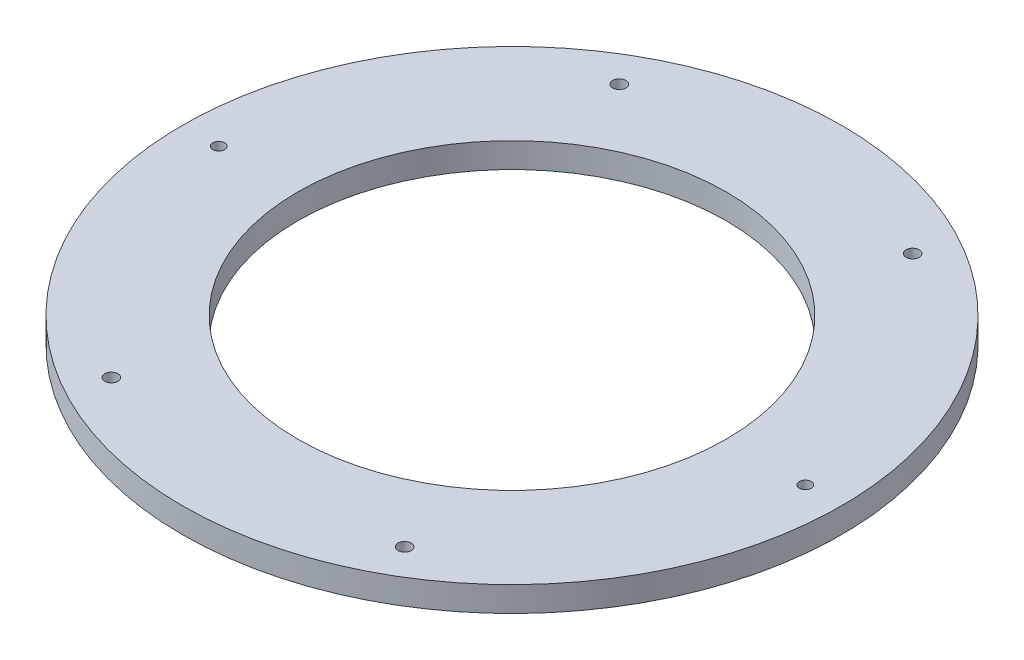
ISO-10303-21;
HEADER;
FILE_DESCRIPTION(('STEP AP214'),'2;1');
FILE_NAME('part.step','',(''),(''),'','','');
FILE_SCHEMA(('AUTOMOTIVE_DESIGN { 1 0 10303 214 1 1 1 1 }'));
ENDSEC;
DATA;
#1=APPLICATION_CONTEXT('core data for automotive mechanical design processes');
#2=APPLICATION_PROTOCOL_DEFINITION('international standard','automotive_design',2000,#1);
#3=PRODUCT_CONTEXT('',#1,'mechanical');
#4=PRODUCT('Part','Part','',(#3));
#5=PRODUCT_RELATED_PRODUCT_CATEGORY('part','',(#4));
#6=PRODUCT_DEFINITION_FORMATION('','',#4);
#7=PRODUCT_DEFINITION_CONTEXT('part definition',#1,'design');
#8=PRODUCT_DEFINITION('design','',#6,#7);
#9=PRODUCT_DEFINITION_SHAPE('','',#8);
#10=(LENGTH_UNIT() NAMED_UNIT(*) SI_UNIT(.MILLI.,.METRE.));
#11=(NAMED_UNIT(*) PLANE_ANGLE_UNIT() SI_UNIT($,.RADIAN.));
#12=(NAMED_UNIT(*) SI_UNIT($,.STERADIAN.) SOLID_ANGLE_UNIT());
#13=UNCERTAINTY_MEASURE_WITH_UNIT(LENGTH_MEASURE(1.E-05),#10,'distance_accuracy_value','');
#14=(GEOMETRIC_REPRESENTATION_CONTEXT(3) GLOBAL_UNCERTAINTY_ASSIGNED_CONTEXT((#13)) GLOBAL_UNIT_ASSIGNED_CONTEXT((#10,
#11,#12)) REPRESENTATION_CONTEXT('',''));
#15=CARTESIAN_POINT('',(0.,0.,0.));
#16=DIRECTION('',(0.,0.,1.));
#17=DIRECTION('',(1.,0.,0.));
#18=AXIS2_PLACEMENT_3D('',#15,#16,#17);
#19=CARTESIAN_POINT('',(0.,9.5,0.));
#20=DIRECTION('',(0.,1.,0.));
#21=DIRECTION('',(0.,0.,1.));
#22=AXIS2_PLACEMENT_3D('',#19,#20,#21);
#23=PLANE('',#22);
#24=CARTESIAN_POINT('',(111.25,9.5,-192.690652342037));
#25=DIRECTION('',(0.,1.,0.));
#26=DIRECTION('',(0.,0.,1.));
#27=AXIS2_PLACEMENT_3D('',#24,#25,#26);
#28=CIRCLE('',#27,4.99999999999979);
#29=CARTESIAN_POINT('',(111.25,9.5,-187.690652342038));
#30=VERTEX_POINT('',#29);
#31=EDGE_CURVE('E74',#30,#30,#28,.T.);
#32=ORIENTED_EDGE('',*,*,#31,.F.);
#33=EDGE_LOOP('',(#32));
#34=FACE_BOUND('',#33,.T.);
#35=CARTESIAN_POINT('',(222.5,9.5,0.));
#36=DIRECTION('',(0.,1.,0.));
#37=DIRECTION('',(0.,0.,1.));
#38=AXIS2_PLACEMENT_3D('',#35,#36,#37);
#39=CIRCLE('',#38,4.49999999999999);
#40=CARTESIAN_POINT('',(222.5,9.5,4.49999999999999));
#41=VERTEX_POINT('',#40);
#42=EDGE_CURVE('E68',#41,#41,#39,.T.);
#43=ORIENTED_EDGE('',*,*,#42,.F.);
#44=EDGE_LOOP('',(#43));
#45=FACE_BOUND('',#44,.T.);
#46=CARTESIAN_POINT('',(-111.249999999999,9.5,192.690652342038));
#47=DIRECTION('',(0.,1.,0.));
#48=DIRECTION('',(0.,0.,-1.));
#49=AXIS2_PLACEMENT_3D('',#46,#47,#48);
#50=CIRCLE('',#49,5.00000000000001);
#51=CARTESIAN_POINT('',(-111.249999999999,9.5,187.690652342038));
#52=VERTEX_POINT('',#51);
#53=EDGE_CURVE('E62',#52,#52,#50,.T.);
#54=ORIENTED_EDGE('',*,*,#53,.F.);
#55=EDGE_LOOP('',(#54));
#56=FACE_BOUND('',#55,.T.);
#57=CARTESIAN_POINT('',(-222.5,9.5,1.55431223447522E-12));
#58=DIRECTION('',(0.,1.,0.));
#59=DIRECTION('',(0.,0.,-1.));
#60=AXIS2_PLACEMENT_3D('',#57,#58,#59);
#61=CIRCLE('',#60,4.49999999999999);
#62=CARTESIAN_POINT('',(-222.5,9.5,-4.49999999999844));
#63=VERTEX_POINT('',#62);
#64=EDGE_CURVE('E55',#63,#63,#61,.T.);
#65=ORIENTED_EDGE('',*,*,#64,.F.);
#66=EDGE_LOOP('',(#65));
#67=FACE_BOUND('',#66,.T.);
#68=CARTESIAN_POINT('',(111.25,9.5,192.690652342038));
#69=DIRECTION('',(0.,1.,0.));
#70=DIRECTION('',(0.,0.,-1.));
#71=AXIS2_PLACEMENT_3D('',#68,#69,#70);
#72=CIRCLE('',#71,5.00000000000001);
#73=CARTESIAN_POINT('',(111.25,9.5,187.690652342038));
#74=VERTEX_POINT('',#73);
#75=EDGE_CURVE('E79',#74,#74,#72,.T.);
#76=ORIENTED_EDGE('',*,*,#75,.F.);
#77=EDGE_LOOP('',(#76));
#78=FACE_BOUND('',#77,.T.);
#79=CARTESIAN_POINT('',(-111.249999999999,9.5,-192.690652342038));
#80=DIRECTION('',(0.,1.,0.));
#81=DIRECTION('',(0.,0.,1.));
#82=AXIS2_PLACEMENT_3D('',#79,#80,#81);
#83=CIRCLE('',#82,4.99999999999977);
#84=CARTESIAN_POINT('',(-111.249999999999,9.5,-187.690652342039));
#85=VERTEX_POINT('',#84);
#86=EDGE_CURVE('E49',#85,#85,#83,.T.);
#87=ORIENTED_EDGE('',*,*,#86,.F.);
#88=EDGE_LOOP('',(#87));
#89=FACE_BOUND('',#88,.T.);
#90=CARTESIAN_POINT('',(0.,9.5,0.));
#91=DIRECTION('',(0.,1.,0.));
#92=DIRECTION('',(0.,0.,1.));
#93=AXIS2_PLACEMENT_3D('',#90,#91,#92);
#94=CIRCLE('',#93,250.);
#95=CARTESIAN_POINT('',(0.,9.5,250.));
#96=VERTEX_POINT('',#95);
#97=EDGE_CURVE('E10',#96,#96,#94,.T.);
#98=ORIENTED_EDGE('',*,*,#97,.T.);
#99=EDGE_LOOP('',(#98));
#100=FACE_BOUND('',#99,.T.);
#101=CARTESIAN_POINT('',(0.,9.5,0.));
#102=DIRECTION('',(0.,1.,0.));
#103=DIRECTION('',(0.,0.,1.));
#104=AXIS2_PLACEMENT_3D('',#101,#102,#103);
#105=CIRCLE('',#104,162.5);
#106=CARTESIAN_POINT('',(0.,9.5,162.5));
#107=VERTEX_POINT('',#106);
#108=EDGE_CURVE('E41',#107,#107,#105,.T.);
#109=ORIENTED_EDGE('',*,*,#108,.F.);
#110=EDGE_LOOP('',(#109));
#111=FACE_BOUND('',#110,.T.);
#112=ADVANCED_FACE('F30',(#34,#45,#56,#67,#78,#89,#100,#111),#23,.T.);
#113=CARTESIAN_POINT('',(0.,-9.5,0.));
#114=DIRECTION('',(0.,1.,0.));
#115=DIRECTION('',(0.,0.,1.));
#116=AXIS2_PLACEMENT_3D('',#113,#114,#115);
#117=PLANE('',#116);
#118=CARTESIAN_POINT('',(111.25,-9.5,-192.690652342037));
#119=DIRECTION('',(0.,1.,0.));
#120=DIRECTION('',(0.,0.,1.));
#121=AXIS2_PLACEMENT_3D('',#118,#119,#120);
#122=CIRCLE('',#121,4.99999999999979);
#123=CARTESIAN_POINT('',(111.25,-9.5,-187.690652342038));
#124=VERTEX_POINT('',#123);
#125=EDGE_CURVE('E52',#124,#124,#122,.T.);
#126=ORIENTED_EDGE('',*,*,#125,.T.);
#127=EDGE_LOOP('',(#126));
#128=FACE_BOUND('',#127,.T.);
#129=CARTESIAN_POINT('',(222.5,-9.5,0.));
#130=DIRECTION('',(0.,1.,0.));
#131=DIRECTION('',(0.,0.,1.));
#132=AXIS2_PLACEMENT_3D('',#129,#130,#131);
#133=CIRCLE('',#132,4.49999999999999);
#134=CARTESIAN_POINT('',(222.5,-9.5,4.49999999999999));
#135=VERTEX_POINT('',#134);
#136=EDGE_CURVE('E71',#135,#135,#133,.T.);
#137=ORIENTED_EDGE('',*,*,#136,.T.);
#138=EDGE_LOOP('',(#137));
#139=FACE_BOUND('',#138,.T.);
#140=CARTESIAN_POINT('',(-111.249999999999,-9.5,192.690652342038));
#141=DIRECTION('',(0.,1.,0.));
#142=DIRECTION('',(0.,0.,-1.));
#143=AXIS2_PLACEMENT_3D('',#140,#141,#142);
#144=CIRCLE('',#143,5.00000000000001);
#145=CARTESIAN_POINT('',(-111.249999999999,-9.5,187.690652342038));
#146=VERTEX_POINT('',#145);
#147=EDGE_CURVE('E65',#146,#146,#144,.T.);
#148=ORIENTED_EDGE('',*,*,#147,.T.);
#149=EDGE_LOOP('',(#148));
#150=FACE_BOUND('',#149,.T.);
#151=CARTESIAN_POINT('',(-222.5,-9.5,1.55431223447522E-12));
#152=DIRECTION('',(0.,1.,0.));
#153=DIRECTION('',(0.,0.,-1.));
#154=AXIS2_PLACEMENT_3D('',#151,#152,#153);
#155=CIRCLE('',#154,4.49999999999999);
#156=CARTESIAN_POINT('',(-222.5,-9.5,-4.49999999999844));
#157=VERTEX_POINT('',#156);
#158=EDGE_CURVE('E58',#157,#157,#155,.T.);
#159=ORIENTED_EDGE('',*,*,#158,.T.);
#160=EDGE_LOOP('',(#159));
#161=FACE_BOUND('',#160,.T.);
#162=CARTESIAN_POINT('',(111.25,-9.5,192.690652342038));
#163=DIRECTION('',(0.,1.,0.));
#164=DIRECTION('',(0.,0.,-1.));
#165=AXIS2_PLACEMENT_3D('',#162,#163,#164);
#166=CIRCLE('',#165,5.00000000000001);
#167=CARTESIAN_POINT('',(111.25,-9.5,187.690652342038));
#168=VERTEX_POINT('',#167);
#169=EDGE_CURVE('E59',#168,#168,#166,.T.);
#170=ORIENTED_EDGE('',*,*,#169,.T.);
#171=EDGE_LOOP('',(#170));
#172=FACE_BOUND('',#171,.T.);
#173=CARTESIAN_POINT('',(-111.249999999999,-9.5,-192.690652342038));
#174=DIRECTION('',(0.,1.,0.));
#175=DIRECTION('',(0.,0.,1.));
#176=AXIS2_PLACEMENT_3D('',#173,#174,#175);
#177=CIRCLE('',#176,4.99999999999977);
#178=CARTESIAN_POINT('',(-111.249999999999,-9.5,-187.690652342039));
#179=VERTEX_POINT('',#178);
#180=EDGE_CURVE('E46',#179,#179,#177,.T.);
#181=ORIENTED_EDGE('',*,*,#180,.T.);
#182=EDGE_LOOP('',(#181));
#183=FACE_BOUND('',#182,.T.);
#184=CARTESIAN_POINT('',(0.,-9.5,0.));
#185=DIRECTION('',(0.,1.,0.));
#186=DIRECTION('',(0.,0.,1.));
#187=AXIS2_PLACEMENT_3D('',#184,#185,#186);
#188=CIRCLE('',#187,250.);
#189=CARTESIAN_POINT('',(0.,-9.5,250.));
#190=VERTEX_POINT('',#189);
#191=EDGE_CURVE('E34',#190,#190,#188,.T.);
#192=ORIENTED_EDGE('',*,*,#191,.F.);
#193=EDGE_LOOP('',(#192));
#194=FACE_BOUND('',#193,.T.);
#195=CARTESIAN_POINT('',(0.,-9.5,0.));
#196=DIRECTION('',(0.,1.,0.));
#197=DIRECTION('',(0.,0.,1.));
#198=AXIS2_PLACEMENT_3D('',#195,#196,#197);
#199=CIRCLE('',#198,162.5);
#200=CARTESIAN_POINT('',(0.,-9.5,162.5));
#201=VERTEX_POINT('',#200);
#202=EDGE_CURVE('E43',#201,#201,#199,.T.);
#203=ORIENTED_EDGE('',*,*,#202,.T.);
#204=EDGE_LOOP('',(#203));
#205=FACE_BOUND('',#204,.T.);
#206=ADVANCED_FACE('F85',(#128,#139,#150,#161,#172,#183,#194,#205),#117,.F.);
#207=CARTESIAN_POINT('',(0.,9.5,0.));
#208=DIRECTION('',(0.,-1.,0.));
#209=DIRECTION('',(0.,0.,-1.));
#210=AXIS2_PLACEMENT_3D('',#207,#208,#209);
#211=CYLINDRICAL_SURFACE('',#210,250.);
#212=ORIENTED_EDGE('',*,*,#97,.F.);
#213=EDGE_LOOP('',(#212));
#214=FACE_BOUND('',#213,.T.);
#215=ORIENTED_EDGE('',*,*,#191,.T.);
#216=EDGE_LOOP('',(#215));
#217=FACE_BOUND('',#216,.T.);
#218=ADVANCED_FACE('F32',(#214,#217),#211,.T.);
#219=CARTESIAN_POINT('',(0.,9.5,0.));
#220=DIRECTION('',(0.,-1.,0.));
#221=DIRECTION('',(0.,0.,-1.));
#222=AXIS2_PLACEMENT_3D('',#219,#220,#221);
#223=CYLINDRICAL_SURFACE('',#222,162.5);
#224=ORIENTED_EDGE('',*,*,#108,.T.);
#225=EDGE_LOOP('',(#224));
#226=FACE_BOUND('',#225,.T.);
#227=ORIENTED_EDGE('',*,*,#202,.F.);
#228=EDGE_LOOP('',(#227));
#229=FACE_BOUND('',#228,.T.);
#230=ADVANCED_FACE('F104',(#226,#229),#223,.F.);
#231=CARTESIAN_POINT('',(-111.249999999999,-9.5,-192.690652342038));
#232=DIRECTION('',(0.,1.,0.));
#233=DIRECTION('',(0.,0.,1.));
#234=AXIS2_PLACEMENT_3D('',#231,#232,#233);
#235=CYLINDRICAL_SURFACE('',#234,4.99999999999977);
#236=ORIENTED_EDGE('',*,*,#180,.F.);
#237=EDGE_LOOP('',(#236));
#238=FACE_BOUND('',#237,.T.);
#239=ORIENTED_EDGE('',*,*,#86,.T.);
#240=EDGE_LOOP('',(#239));
#241=FACE_BOUND('',#240,.T.);
#242=ADVANCED_FACE('F92',(#238,#241),#235,.F.);
#243=CARTESIAN_POINT('',(111.25,-9.5,192.690652342038));
#244=DIRECTION('',(0.,1.,0.));
#245=DIRECTION('',(0.,0.,1.));
#246=AXIS2_PLACEMENT_3D('',#243,#244,#245);
#247=CYLINDRICAL_SURFACE('',#246,5.00000000000001);
#248=ORIENTED_EDGE('',*,*,#169,.F.);
#249=EDGE_LOOP('',(#248));
#250=FACE_BOUND('',#249,.T.);
#251=ORIENTED_EDGE('',*,*,#75,.T.);
#252=EDGE_LOOP('',(#251));
#253=FACE_BOUND('',#252,.T.);
#254=ADVANCED_FACE('F88',(#250,#253),#247,.F.);
#255=CARTESIAN_POINT('',(-222.5,-9.5,1.55431223447522E-12));
#256=DIRECTION('',(0.,1.,0.));
#257=DIRECTION('',(0.,0.,1.));
#258=AXIS2_PLACEMENT_3D('',#255,#256,#257);
#259=CYLINDRICAL_SURFACE('',#258,4.49999999999999);
#260=ORIENTED_EDGE('',*,*,#158,.F.);
#261=EDGE_LOOP('',(#260));
#262=FACE_BOUND('',#261,.T.);
#263=ORIENTED_EDGE('',*,*,#64,.T.);
#264=EDGE_LOOP('',(#263));
#265=FACE_BOUND('',#264,.T.);
#266=ADVANCED_FACE('F91',(#262,#265),#259,.F.);
#267=CARTESIAN_POINT('',(-111.249999999999,-9.5,192.690652342038));
#268=DIRECTION('',(0.,1.,0.));
#269=DIRECTION('',(0.,0.,1.));
#270=AXIS2_PLACEMENT_3D('',#267,#268,#269);
#271=CYLINDRICAL_SURFACE('',#270,5.00000000000001);
#272=ORIENTED_EDGE('',*,*,#147,.F.);
#273=EDGE_LOOP('',(#272));
#274=FACE_BOUND('',#273,.T.);
#275=ORIENTED_EDGE('',*,*,#53,.T.);
#276=EDGE_LOOP('',(#275));
#277=FACE_BOUND('',#276,.T.);
#278=ADVANCED_FACE('F123',(#274,#277),#271,.F.);
#279=CARTESIAN_POINT('',(222.5,-9.5,0.));
#280=DIRECTION('',(0.,1.,0.));
#281=DIRECTION('',(0.,0.,1.));
#282=AXIS2_PLACEMENT_3D('',#279,#280,#281);
#283=CYLINDRICAL_SURFACE('',#282,4.49999999999999);
#284=ORIENTED_EDGE('',*,*,#136,.F.);
#285=EDGE_LOOP('',(#284));
#286=FACE_BOUND('',#285,.T.);
#287=ORIENTED_EDGE('',*,*,#42,.T.);
#288=EDGE_LOOP('',(#287));
#289=FACE_BOUND('',#288,.T.);
#290=ADVANCED_FACE('F127',(#286,#289),#283,.F.);
#291=CARTESIAN_POINT('',(111.25,-9.5,-192.690652342037));
#292=DIRECTION('',(0.,1.,0.));
#293=DIRECTION('',(0.,0.,1.));
#294=AXIS2_PLACEMENT_3D('',#291,#292,#293);
#295=CYLINDRICAL_SURFACE('',#294,4.99999999999979);
#296=ORIENTED_EDGE('',*,*,#125,.F.);
#297=EDGE_LOOP('',(#296));
#298=FACE_BOUND('',#297,.T.);
#299=ORIENTED_EDGE('',*,*,#31,.T.);
#300=EDGE_LOOP('',(#299));
#301=FACE_BOUND('',#300,.T.);
#302=ADVANCED_FACE('F131',(#298,#301),#295,.F.);
#303=CLOSED_SHELL('',(#112,#206,#218,#230,#242,#254,#266,#278,#290,#302));
#304=MANIFOLD_SOLID_BREP('B2',#303);
#305=ADVANCED_BREP_SHAPE_REPRESENTATION('',(#18,#304),#14);
#306=SHAPE_DEFINITION_REPRESENTATION(#9,#305);
ENDSEC;
END-ISO-10303-21;
